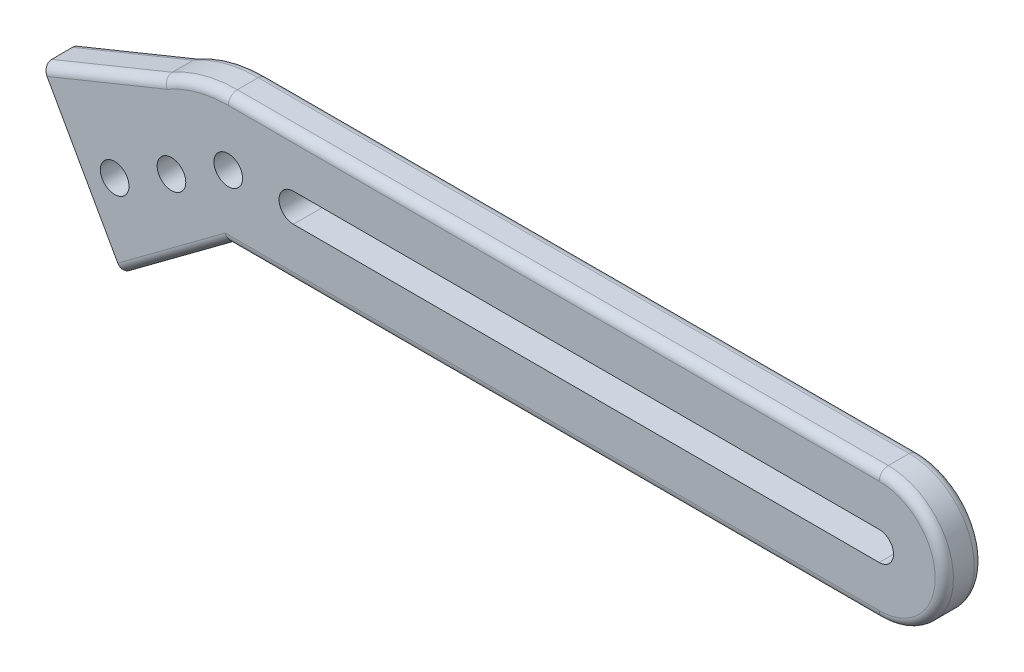
ISO-10303-21;
HEADER;
FILE_DESCRIPTION(('STEP AP214'),'2;1');
FILE_NAME('part.step','',(''),(''),'','','');
FILE_SCHEMA(('AUTOMOTIVE_DESIGN { 1 0 10303 214 1 1 1 1 }'));
ENDSEC;
DATA;
#1=APPLICATION_CONTEXT('core data for automotive mechanical design processes');
#2=APPLICATION_PROTOCOL_DEFINITION('international standard','automotive_design',2000,#1);
#3=PRODUCT_CONTEXT('',#1,'mechanical');
#4=PRODUCT('Part','Part','',(#3));
#5=PRODUCT_RELATED_PRODUCT_CATEGORY('part','',(#4));
#6=PRODUCT_DEFINITION_FORMATION('','',#4);
#7=PRODUCT_DEFINITION_CONTEXT('part definition',#1,'design');
#8=PRODUCT_DEFINITION('design','',#6,#7);
#9=PRODUCT_DEFINITION_SHAPE('','',#8);
#10=(LENGTH_UNIT() NAMED_UNIT(*) SI_UNIT(.MILLI.,.METRE.));
#11=(NAMED_UNIT(*) PLANE_ANGLE_UNIT() SI_UNIT($,.RADIAN.));
#12=(NAMED_UNIT(*) SI_UNIT($,.STERADIAN.) SOLID_ANGLE_UNIT());
#13=UNCERTAINTY_MEASURE_WITH_UNIT(LENGTH_MEASURE(1.E-05),#10,'distance_accuracy_value','');
#14=(GEOMETRIC_REPRESENTATION_CONTEXT(3) GLOBAL_UNCERTAINTY_ASSIGNED_CONTEXT((#13)) GLOBAL_UNIT_ASSIGNED_CONTEXT((#10,
#11,#12)) REPRESENTATION_CONTEXT('',''));
#15=CARTESIAN_POINT('',(0.,0.,0.));
#16=DIRECTION('',(0.,0.,1.));
#17=DIRECTION('',(1.,0.,0.));
#18=AXIS2_PLACEMENT_3D('',#15,#16,#17);
#19=CARTESIAN_POINT('',(0.,-5.,3.));
#20=DIRECTION('',(0.,0.,-1.));
#21=DIRECTION('',(-1.,0.,0.));
#22=AXIS2_PLACEMENT_3D('',#19,#20,#21);
#23=CYLINDRICAL_SURFACE('',#22,10.);
#24=DIRECTION('',(0.,0.,-1.));
#25=VECTOR('',#24,1.);
#26=CARTESIAN_POINT('',(-4.99999999999996,3.66025403784442,3.));
#27=LINE('',#26,#25);
#28=CARTESIAN_POINT('',(-4.99999999999996,3.66025403784442,2.3));
#29=VERTEX_POINT('',#28);
#30=CARTESIAN_POINT('',(-4.99999999999996,3.66025403784442,0.7));
#31=VERTEX_POINT('',#30);
#32=EDGE_CURVE('E392',#29,#31,#27,.T.);
#33=ORIENTED_EDGE('',*,*,#32,.F.);
#34=CARTESIAN_POINT('',(0.,-5.,2.3));
#35=DIRECTION('',(0.,0.,1.));
#36=DIRECTION('',(1.,0.,0.));
#37=AXIS2_PLACEMENT_3D('',#34,#35,#36);
#38=CIRCLE('',#37,10.);
#39=CARTESIAN_POINT('',(0.,5.,2.3));
#40=VERTEX_POINT('',#39);
#41=EDGE_CURVE('E225',#29,#40,#38,.F.);
#42=ORIENTED_EDGE('',*,*,#41,.T.);
#43=DIRECTION('',(0.,0.,-1.));
#44=VECTOR('',#43,1.);
#45=CARTESIAN_POINT('',(0.,5.,3.));
#46=LINE('',#45,#44);
#47=CARTESIAN_POINT('',(0.,5.,0.7));
#48=VERTEX_POINT('',#47);
#49=EDGE_CURVE('E519',#40,#48,#46,.T.);
#50=ORIENTED_EDGE('',*,*,#49,.T.);
#51=CARTESIAN_POINT('',(0.,-5.,0.7));
#52=DIRECTION('',(0.,0.,1.));
#53=DIRECTION('',(1.,0.,0.));
#54=AXIS2_PLACEMENT_3D('',#51,#52,#53);
#55=CIRCLE('',#54,10.);
#56=EDGE_CURVE('E222',#48,#31,#55,.T.);
#57=ORIENTED_EDGE('',*,*,#56,.T.);
#58=EDGE_LOOP('',(#33,#42,#50,#57));
#59=FACE_BOUND('',#58,.T.);
#60=ADVANCED_FACE('F44',(#59),#23,.T.);
#61=CARTESIAN_POINT('',(-4.99999999999996,3.66025403784442,3.));
#62=DIRECTION('',(0.377162887212808,-0.926146941100222,0.));
#63=DIRECTION('',(0.926146941100222,0.377162887212808,0.));
#64=AXIS2_PLACEMENT_3D('',#61,#62,#63);
#65=PLANE('',#64);
#66=DIRECTION('',(-0.926146941100222,-0.377162887212808,0.));
#67=VECTOR('',#66,1.);
#68=CARTESIAN_POINT('',(-4.99999999999996,3.66025403784442,0.7));
#69=LINE('',#68,#67);
#70=CARTESIAN_POINT('',(-14.2634471787925,-0.112180257890802,0.7));
#71=VERTEX_POINT('',#70);
#72=EDGE_CURVE('E234',#31,#71,#69,.T.);
#73=ORIENTED_EDGE('',*,*,#72,.T.);
#74=DIRECTION('',(0.,0.,1.));
#75=VECTOR('',#74,1.);
#76=CARTESIAN_POINT('',(-14.2634471787925,-0.112180257890802,3.));
#77=LINE('',#76,#75);
#78=CARTESIAN_POINT('',(-14.2634471787925,-0.112180257890802,2.3));
#79=VERTEX_POINT('',#78);
#80=EDGE_CURVE('E454',#71,#79,#77,.T.);
#81=ORIENTED_EDGE('',*,*,#80,.T.);
#82=DIRECTION('',(-0.926146941100222,-0.377162887212808,0.));
#83=VECTOR('',#82,1.);
#84=CARTESIAN_POINT('',(-4.99999999999996,3.66025403784442,2.3));
#85=LINE('',#84,#83);
#86=EDGE_CURVE('E238',#79,#29,#85,.F.);
#87=ORIENTED_EDGE('',*,*,#86,.T.);
#88=ORIENTED_EDGE('',*,*,#32,.T.);
#89=EDGE_LOOP('',(#73,#81,#87,#88));
#90=FACE_BOUND('',#89,.T.);
#91=ADVANCED_FACE('F278',(#90),#65,.F.);
#92=CARTESIAN_POINT('',(0.,-5.,3.));
#93=DIRECTION('',(-0.596248636176985,0.802799828012616,0.));
#94=DIRECTION('',(-0.802799828012616,-0.596248636176985,0.));
#95=AXIS2_PLACEMENT_3D('',#92,#93,#94);
#96=PLANE('',#95);
#97=DIRECTION('',(0.802799828012616,0.596248636176985,0.));
#98=VECTOR('',#97,1.);
#99=CARTESIAN_POINT('',(-176.615962162776,-136.174699958937,2.3));
#100=LINE('',#99,#98);
#101=CARTESIAN_POINT('',(0.,-5.,2.3));
#102=VERTEX_POINT('',#101);
#103=CARTESIAN_POINT('',(-8.14085036954468,-11.0463029024038,2.3));
#104=VERTEX_POINT('',#103);
#105=EDGE_CURVE('E241',#102,#104,#100,.F.);
#106=ORIENTED_EDGE('',*,*,#105,.T.);
#107=DIRECTION('',(0.,0.,-1.));
#108=VECTOR('',#107,1.);
#109=CARTESIAN_POINT('',(-8.14085036954467,-11.0463029024038,3.));
#110=LINE('',#109,#108);
#111=CARTESIAN_POINT('',(-8.14085036954467,-11.0463029024038,0.7));
#112=VERTEX_POINT('',#111);
#113=EDGE_CURVE('E59',#104,#112,#110,.T.);
#114=ORIENTED_EDGE('',*,*,#113,.T.);
#115=DIRECTION('',(0.802799828012616,0.596248636176985,0.));
#116=VECTOR('',#115,1.);
#117=CARTESIAN_POINT('',(0.,-5.,0.7));
#118=LINE('',#117,#116);
#119=CARTESIAN_POINT('',(0.,-5.,0.7));
#120=VERTEX_POINT('',#119);
#121=EDGE_CURVE('E53',#112,#120,#118,.T.);
#122=ORIENTED_EDGE('',*,*,#121,.T.);
#123=DIRECTION('',(0.,0.,-1.));
#124=VECTOR('',#123,1.);
#125=CARTESIAN_POINT('',(0.,-5.,3.));
#126=LINE('',#125,#124);
#127=EDGE_CURVE('E387',#102,#120,#126,.T.);
#128=ORIENTED_EDGE('',*,*,#127,.F.);
#129=EDGE_LOOP('',(#106,#114,#122,#128));
#130=FACE_BOUND('',#129,.T.);
#131=ADVANCED_FACE('F282',(#130),#96,.F.);
#132=CARTESIAN_POINT('',(0.,-5.,3.));
#133=DIRECTION('',(0.,1.,0.));
#134=DIRECTION('',(0.,0.,1.));
#135=AXIS2_PLACEMENT_3D('',#132,#133,#134);
#136=PLANE('',#135);
#137=ORIENTED_EDGE('',*,*,#127,.T.);
#138=DIRECTION('',(1.,0.,0.));
#139=VECTOR('',#138,1.);
#140=CARTESIAN_POINT('',(0.,-5.,0.7));
#141=LINE('',#140,#139);
#142=CARTESIAN_POINT('',(50.,-5.,0.7));
#143=VERTEX_POINT('',#142);
#144=EDGE_CURVE('E231',#120,#143,#141,.T.);
#145=ORIENTED_EDGE('',*,*,#144,.T.);
#146=DIRECTION('',(0.,0.,-1.));
#147=VECTOR('',#146,1.);
#148=CARTESIAN_POINT('',(50.,-5.,3.));
#149=LINE('',#148,#147);
#150=CARTESIAN_POINT('',(50.,-5.,2.3));
#151=VERTEX_POINT('',#150);
#152=EDGE_CURVE('E390',#151,#143,#149,.T.);
#153=ORIENTED_EDGE('',*,*,#152,.F.);
#154=DIRECTION('',(1.,0.,0.));
#155=VECTOR('',#154,1.);
#156=CARTESIAN_POINT('',(0.,-5.,2.3));
#157=LINE('',#156,#155);
#158=EDGE_CURVE('E228',#151,#102,#157,.F.);
#159=ORIENTED_EDGE('',*,*,#158,.T.);
#160=EDGE_LOOP('',(#137,#145,#153,#159));
#161=FACE_BOUND('',#160,.T.);
#162=ADVANCED_FACE('F286',(#161),#136,.F.);
#163=CARTESIAN_POINT('',(50.,0.,3.));
#164=DIRECTION('',(0.,0.,-1.));
#165=DIRECTION('',(-1.,0.,0.));
#166=AXIS2_PLACEMENT_3D('',#163,#164,#165);
#167=CYLINDRICAL_SURFACE('',#166,5.);
#168=ORIENTED_EDGE('',*,*,#152,.T.);
#169=CARTESIAN_POINT('',(50.,0.,0.7));
#170=DIRECTION('',(0.,0.,1.));
#171=DIRECTION('',(1.,0.,0.));
#172=AXIS2_PLACEMENT_3D('',#169,#170,#171);
#173=CIRCLE('',#172,5.);
#174=CARTESIAN_POINT('',(50.,5.,0.7));
#175=VERTEX_POINT('',#174);
#176=EDGE_CURVE('E213',#143,#175,#173,.T.);
#177=ORIENTED_EDGE('',*,*,#176,.T.);
#178=DIRECTION('',(0.,0.,-1.));
#179=VECTOR('',#178,1.);
#180=CARTESIAN_POINT('',(50.,5.,3.));
#181=LINE('',#180,#179);
#182=CARTESIAN_POINT('',(50.,5.,2.3));
#183=VERTEX_POINT('',#182);
#184=EDGE_CURVE('E399',#183,#175,#181,.T.);
#185=ORIENTED_EDGE('',*,*,#184,.F.);
#186=CARTESIAN_POINT('',(50.,0.,2.3));
#187=DIRECTION('',(0.,0.,1.));
#188=DIRECTION('',(1.,0.,0.));
#189=AXIS2_PLACEMENT_3D('',#186,#187,#188);
#190=CIRCLE('',#189,5.);
#191=EDGE_CURVE('E210',#183,#151,#190,.F.);
#192=ORIENTED_EDGE('',*,*,#191,.T.);
#193=EDGE_LOOP('',(#168,#177,#185,#192));
#194=FACE_BOUND('',#193,.T.);
#195=ADVANCED_FACE('F289',(#194),#167,.T.);
#196=CARTESIAN_POINT('',(0.,5.,3.));
#197=DIRECTION('',(0.,-1.,0.));
#198=DIRECTION('',(1.,0.,0.));
#199=AXIS2_PLACEMENT_3D('',#196,#197,#198);
#200=PLANE('',#199);
#201=ORIENTED_EDGE('',*,*,#49,.F.);
#202=DIRECTION('',(-1.,0.,0.));
#203=VECTOR('',#202,1.);
#204=CARTESIAN_POINT('',(50.,5.,2.3));
#205=LINE('',#204,#203);
#206=EDGE_CURVE('E219',#40,#183,#205,.F.);
#207=ORIENTED_EDGE('',*,*,#206,.T.);
#208=ORIENTED_EDGE('',*,*,#184,.T.);
#209=DIRECTION('',(-1.,0.,0.));
#210=VECTOR('',#209,1.);
#211=CARTESIAN_POINT('',(0.,5.,0.7));
#212=LINE('',#211,#210);
#213=EDGE_CURVE('E216',#175,#48,#212,.T.);
#214=ORIENTED_EDGE('',*,*,#213,.T.);
#215=EDGE_LOOP('',(#201,#207,#208,#214));
#216=FACE_BOUND('',#215,.T.);
#217=ADVANCED_FACE('F293',(#216),#200,.F.);
#218=CARTESIAN_POINT('',(0.,-5.,3.));
#219=DIRECTION('',(0.,0.,1.));
#220=DIRECTION('',(1.,0.,0.));
#221=AXIS2_PLACEMENT_3D('',#218,#219,#220);
#222=PLANE('',#221);
#223=DIRECTION('',(-0.488572273581656,0.872523428617966,0.));
#224=VECTOR('',#223,1.);
#225=CARTESIAN_POINT('',(-10.9065428577246,-6.10715341977064,3.));
#226=LINE('',#225,#224);
#227=CARTESIAN_POINT('',(-8.48568821434412,-10.4304695550549,3.));
#228=VERTEX_POINT('',#227);
#229=CARTESIAN_POINT('',(-13.9188122786738,-0.727651173726009,3.));
#230=VERTEX_POINT('',#229);
#231=EDGE_CURVE('E168',#228,#230,#226,.T.);
#232=ORIENTED_EDGE('',*,*,#231,.F.);
#233=DIRECTION('',(0.802799828012616,0.596248636176985,0.));
#234=VECTOR('',#233,1.);
#235=CARTESIAN_POINT('',(-0.417374045323888,-4.43804012039117,3.));
#236=LINE('',#235,#234);
#237=CARTESIAN_POINT('',(-0.231514358298999,-4.3,3.));
#238=VERTEX_POINT('',#237);
#239=EDGE_CURVE('E178',#228,#238,#236,.T.);
#240=ORIENTED_EDGE('',*,*,#239,.T.);
#241=DIRECTION('',(1.,0.,0.));
#242=VECTOR('',#241,1.);
#243=CARTESIAN_POINT('',(50.,-4.3,3.));
#244=LINE('',#243,#242);
#245=CARTESIAN_POINT('',(50.,-4.3,3.));
#246=VERTEX_POINT('',#245);
#247=EDGE_CURVE('E189',#238,#246,#244,.T.);
#248=ORIENTED_EDGE('',*,*,#247,.T.);
#249=CARTESIAN_POINT('',(50.,0.,3.));
#250=DIRECTION('',(0.,0.,1.));
#251=DIRECTION('',(1.,0.,0.));
#252=AXIS2_PLACEMENT_3D('',#249,#250,#251);
#253=CIRCLE('',#252,4.3);
#254=CARTESIAN_POINT('',(50.,4.3,3.));
#255=VERTEX_POINT('',#254);
#256=EDGE_CURVE('E194',#246,#255,#253,.T.);
#257=ORIENTED_EDGE('',*,*,#256,.T.);
#258=DIRECTION('',(-1.,0.,0.));
#259=VECTOR('',#258,1.);
#260=CARTESIAN_POINT('',(0.,4.3,3.));
#261=LINE('',#260,#259);
#262=CARTESIAN_POINT('',(0.,4.30000000000001,3.));
#263=VERTEX_POINT('',#262);
#264=EDGE_CURVE('E207',#255,#263,#261,.T.);
#265=ORIENTED_EDGE('',*,*,#264,.T.);
#266=CARTESIAN_POINT('',(0.,-5.,3.));
#267=DIRECTION('',(0.,0.,1.));
#268=DIRECTION('',(1.,0.,0.));
#269=AXIS2_PLACEMENT_3D('',#266,#267,#268);
#270=CIRCLE('',#269,9.30000000000001);
#271=CARTESIAN_POINT('',(-4.69074070136346,3.03037680763315,3.));
#272=VERTEX_POINT('',#271);
#273=EDGE_CURVE('E204',#263,#272,#270,.T.);
#274=ORIENTED_EDGE('',*,*,#273,.T.);
#275=DIRECTION('',(-0.926146941100222,-0.377162887212808,0.));
#276=VECTOR('',#275,1.);
#277=CARTESIAN_POINT('',(-208.488313021,-79.9638840077436,3.));
#278=LINE('',#277,#276);
#279=EDGE_CURVE('E181',#272,#230,#278,.T.);
#280=ORIENTED_EDGE('',*,*,#279,.T.);
#281=EDGE_LOOP('',(#232,#240,#248,#257,#265,#274,#280));
#282=FACE_BOUND('',#281,.T.);
#283=CARTESIAN_POINT('',(-8.72523428617969,-4.88572273581651,3.));
#284=DIRECTION('',(0.,0.,1.));
#285=DIRECTION('',(1.,0.,0.));
#286=AXIS2_PLACEMENT_3D('',#283,#284,#285);
#287=CIRCLE('',#286,1.09999999999999);
#288=CARTESIAN_POINT('',(-7.6252342861797,-4.88572273581651,3.));
#289=VERTEX_POINT('',#288);
#290=EDGE_CURVE('E430',#289,#289,#287,.T.);
#291=ORIENTED_EDGE('',*,*,#290,.F.);
#292=EDGE_LOOP('',(#291));
#293=FACE_BOUND('',#292,.T.);
#294=CARTESIAN_POINT('',(-4.36261714308985,-2.44286136790826,3.));
#295=DIRECTION('',(0.,0.,1.));
#296=DIRECTION('',(1.,0.,0.));
#297=AXIS2_PLACEMENT_3D('',#294,#295,#296);
#298=CIRCLE('',#297,1.09999999999999);
#299=CARTESIAN_POINT('',(-3.26261714308986,-2.44286136790826,3.));
#300=VERTEX_POINT('',#299);
#301=EDGE_CURVE('E468',#300,#300,#298,.T.);
#302=ORIENTED_EDGE('',*,*,#301,.F.);
#303=EDGE_LOOP('',(#302));
#304=FACE_BOUND('',#303,.T.);
#305=CARTESIAN_POINT('',(0.,0.,3.));
#306=DIRECTION('',(0.,0.,1.));
#307=DIRECTION('',(1.,0.,0.));
#308=AXIS2_PLACEMENT_3D('',#305,#306,#307);
#309=CIRCLE('',#308,1.09999999999999);
#310=CARTESIAN_POINT('',(1.09999999999999,0.,3.));
#311=VERTEX_POINT('',#310);
#312=EDGE_CURVE('E476',#311,#311,#309,.T.);
#313=ORIENTED_EDGE('',*,*,#312,.F.);
#314=EDGE_LOOP('',(#313));
#315=FACE_BOUND('',#314,.T.);
#316=CARTESIAN_POINT('',(5.,0.,3.));
#317=DIRECTION('',(0.,0.,1.));
#318=DIRECTION('',(1.,0.,0.));
#319=AXIS2_PLACEMENT_3D('',#316,#317,#318);
#320=CIRCLE('',#319,1.1);
#321=CARTESIAN_POINT('',(5.,1.1,3.));
#322=VERTEX_POINT('',#321);
#323=CARTESIAN_POINT('',(5.,-1.1,3.));
#324=VERTEX_POINT('',#323);
#325=EDGE_CURVE('E484',#322,#324,#320,.T.);
#326=ORIENTED_EDGE('',*,*,#325,.F.);
#327=DIRECTION('',(-1.,0.,0.));
#328=VECTOR('',#327,1.);
#329=CARTESIAN_POINT('',(5.,1.1,3.));
#330=LINE('',#329,#328);
#331=CARTESIAN_POINT('',(50.,1.1,3.));
#332=VERTEX_POINT('',#331);
#333=EDGE_CURVE('E490',#332,#322,#330,.T.);
#334=ORIENTED_EDGE('',*,*,#333,.F.);
#335=CARTESIAN_POINT('',(50.,0.,3.));
#336=DIRECTION('',(0.,0.,1.));
#337=DIRECTION('',(1.,0.,0.));
#338=AXIS2_PLACEMENT_3D('',#335,#336,#337);
#339=CIRCLE('',#338,1.1);
#340=CARTESIAN_POINT('',(50.,-1.1,3.));
#341=VERTEX_POINT('',#340);
#342=EDGE_CURVE('E509',#341,#332,#339,.T.);
#343=ORIENTED_EDGE('',*,*,#342,.F.);
#344=DIRECTION('',(1.,0.,0.));
#345=VECTOR('',#344,1.);
#346=CARTESIAN_POINT('',(5.,-1.1,3.));
#347=LINE('',#346,#345);
#348=EDGE_CURVE('E505',#324,#341,#347,.T.);
#349=ORIENTED_EDGE('',*,*,#348,.F.);
#350=EDGE_LOOP('',(#326,#334,#343,#349));
#351=FACE_BOUND('',#350,.T.);
#352=ADVANCED_FACE('F176',(#282,#293,#304,#315,#351),#222,.T.);
#353=CARTESIAN_POINT('',(0.,-5.,0.));
#354=DIRECTION('',(0.,0.,1.));
#355=DIRECTION('',(1.,0.,0.));
#356=AXIS2_PLACEMENT_3D('',#353,#354,#355);
#357=PLANE('',#356);
#358=DIRECTION('',(0.802799828012616,0.596248636176985,0.));
#359=VECTOR('',#358,1.);
#360=CARTESIAN_POINT('',(-0.417374045323892,-4.43804012039117,0.));
#361=LINE('',#360,#359);
#362=CARTESIAN_POINT('',(-0.231514358298999,-4.3,0.));
#363=VERTEX_POINT('',#362);
#364=CARTESIAN_POINT('',(-8.48568821434412,-10.4304695550549,0.));
#365=VERTEX_POINT('',#364);
#366=EDGE_CURVE('E397',#363,#365,#361,.F.);
#367=ORIENTED_EDGE('',*,*,#366,.T.);
#368=DIRECTION('',(-0.488572273581656,0.872523428617967,0.));
#369=VECTOR('',#368,1.);
#370=CARTESIAN_POINT('',(-8.77508908135887,-9.91363908720696,0.));
#371=LINE('',#370,#369);
#372=CARTESIAN_POINT('',(-13.9188122786738,-0.727651173726005,0.));
#373=VERTEX_POINT('',#372);
#374=EDGE_CURVE('E440',#365,#373,#371,.T.);
#375=ORIENTED_EDGE('',*,*,#374,.T.);
#376=DIRECTION('',(-0.926146941100222,-0.377162887212808,0.));
#377=VECTOR('',#376,1.);
#378=CARTESIAN_POINT('',(-3.47234341606038,3.52655534853645,0.));
#379=LINE('',#378,#377);
#380=CARTESIAN_POINT('',(-4.69074070136347,3.03037680763315,0.));
#381=VERTEX_POINT('',#380);
#382=EDGE_CURVE('E412',#373,#381,#379,.F.);
#383=ORIENTED_EDGE('',*,*,#382,.T.);
#384=CARTESIAN_POINT('',(0.,-5.,0.));
#385=DIRECTION('',(0.,0.,1.));
#386=DIRECTION('',(1.,0.,0.));
#387=AXIS2_PLACEMENT_3D('',#384,#385,#386);
#388=CIRCLE('',#387,9.30000000000001);
#389=CARTESIAN_POINT('',(0.,4.3,0.));
#390=VERTEX_POINT('',#389);
#391=EDGE_CURVE('E190',#381,#390,#388,.F.);
#392=ORIENTED_EDGE('',*,*,#391,.T.);
#393=DIRECTION('',(-1.,0.,0.));
#394=VECTOR('',#393,1.);
#395=CARTESIAN_POINT('',(0.,4.3,0.));
#396=LINE('',#395,#394);
#397=CARTESIAN_POINT('',(50.,4.3,0.));
#398=VERTEX_POINT('',#397);
#399=EDGE_CURVE('E196',#390,#398,#396,.F.);
#400=ORIENTED_EDGE('',*,*,#399,.T.);
#401=CARTESIAN_POINT('',(50.,0.,0.));
#402=DIRECTION('',(0.,0.,1.));
#403=DIRECTION('',(1.,0.,0.));
#404=AXIS2_PLACEMENT_3D('',#401,#402,#403);
#405=CIRCLE('',#404,4.3);
#406=CARTESIAN_POINT('',(50.,-4.3,0.));
#407=VERTEX_POINT('',#406);
#408=EDGE_CURVE('E409',#398,#407,#405,.F.);
#409=ORIENTED_EDGE('',*,*,#408,.T.);
#410=DIRECTION('',(1.,0.,0.));
#411=VECTOR('',#410,1.);
#412=CARTESIAN_POINT('',(0.,-4.3,0.));
#413=LINE('',#412,#411);
#414=EDGE_CURVE('E406',#407,#363,#413,.F.);
#415=ORIENTED_EDGE('',*,*,#414,.T.);
#416=EDGE_LOOP('',(#367,#375,#383,#392,#400,#409,#415));
#417=FACE_BOUND('',#416,.T.);
#418=CARTESIAN_POINT('',(-8.72523428617969,-4.88572273581651,0.));
#419=DIRECTION('',(0.,0.,1.));
#420=DIRECTION('',(1.,0.,0.));
#421=AXIS2_PLACEMENT_3D('',#418,#419,#420);
#422=CIRCLE('',#421,1.09999999999999);
#423=CARTESIAN_POINT('',(-7.6252342861797,-4.88572273581651,0.));
#424=VERTEX_POINT('',#423);
#425=EDGE_CURVE('E464',#424,#424,#422,.T.);
#426=ORIENTED_EDGE('',*,*,#425,.T.);
#427=EDGE_LOOP('',(#426));
#428=FACE_BOUND('',#427,.T.);
#429=CARTESIAN_POINT('',(-4.36261714308985,-2.44286136790826,0.));
#430=DIRECTION('',(0.,0.,1.));
#431=DIRECTION('',(1.,0.,0.));
#432=AXIS2_PLACEMENT_3D('',#429,#430,#431);
#433=CIRCLE('',#432,1.09999999999999);
#434=CARTESIAN_POINT('',(-3.26261714308985,-2.44286136790826,0.));
#435=VERTEX_POINT('',#434);
#436=EDGE_CURVE('E472',#435,#435,#433,.T.);
#437=ORIENTED_EDGE('',*,*,#436,.T.);
#438=EDGE_LOOP('',(#437));
#439=FACE_BOUND('',#438,.T.);
#440=CARTESIAN_POINT('',(0.,0.,0.));
#441=DIRECTION('',(0.,0.,1.));
#442=DIRECTION('',(1.,0.,0.));
#443=AXIS2_PLACEMENT_3D('',#440,#441,#442);
#444=CIRCLE('',#443,1.09999999999999);
#445=CARTESIAN_POINT('',(1.09999999999999,0.,0.));
#446=VERTEX_POINT('',#445);
#447=EDGE_CURVE('E480',#446,#446,#444,.T.);
#448=ORIENTED_EDGE('',*,*,#447,.T.);
#449=EDGE_LOOP('',(#448));
#450=FACE_BOUND('',#449,.T.);
#451=DIRECTION('',(-1.,0.,0.));
#452=VECTOR('',#451,1.);
#453=CARTESIAN_POINT('',(5.,1.1,0.));
#454=LINE('',#453,#452);
#455=CARTESIAN_POINT('',(50.,1.1,0.));
#456=VERTEX_POINT('',#455);
#457=CARTESIAN_POINT('',(5.,1.1,0.));
#458=VERTEX_POINT('',#457);
#459=EDGE_CURVE('E498',#456,#458,#454,.T.);
#460=ORIENTED_EDGE('',*,*,#459,.T.);
#461=CARTESIAN_POINT('',(5.,0.,0.));
#462=DIRECTION('',(0.,0.,1.));
#463=DIRECTION('',(1.,0.,0.));
#464=AXIS2_PLACEMENT_3D('',#461,#462,#463);
#465=CIRCLE('',#464,1.1);
#466=CARTESIAN_POINT('',(5.,-1.1,0.));
#467=VERTEX_POINT('',#466);
#468=EDGE_CURVE('E485',#458,#467,#465,.T.);
#469=ORIENTED_EDGE('',*,*,#468,.T.);
#470=DIRECTION('',(1.,0.,0.));
#471=VECTOR('',#470,1.);
#472=CARTESIAN_POINT('',(5.,-1.1,0.));
#473=LINE('',#472,#471);
#474=CARTESIAN_POINT('',(50.,-1.1,0.));
#475=VERTEX_POINT('',#474);
#476=EDGE_CURVE('E489',#467,#475,#473,.T.);
#477=ORIENTED_EDGE('',*,*,#476,.T.);
#478=CARTESIAN_POINT('',(50.,0.,0.));
#479=DIRECTION('',(0.,0.,1.));
#480=DIRECTION('',(1.,0.,0.));
#481=AXIS2_PLACEMENT_3D('',#478,#479,#480);
#482=CIRCLE('',#481,1.1);
#483=EDGE_CURVE('E494',#475,#456,#482,.T.);
#484=ORIENTED_EDGE('',*,*,#483,.T.);
#485=EDGE_LOOP('',(#460,#469,#477,#484));
#486=FACE_BOUND('',#485,.T.);
#487=ADVANCED_FACE('F298',(#417,#428,#439,#450,#486),#357,.F.);
#488=CARTESIAN_POINT('',(5.,0.,0.));
#489=DIRECTION('',(0.,0.,1.));
#490=DIRECTION('',(1.,0.,0.));
#491=AXIS2_PLACEMENT_3D('',#488,#489,#490);
#492=CYLINDRICAL_SURFACE('',#491,1.1);
#493=ORIENTED_EDGE('',*,*,#325,.T.);
#494=DIRECTION('',(0.,0.,1.));
#495=VECTOR('',#494,1.);
#496=CARTESIAN_POINT('',(5.,-1.1,0.));
#497=LINE('',#496,#495);
#498=EDGE_CURVE('E502',#467,#324,#497,.T.);
#499=ORIENTED_EDGE('',*,*,#498,.F.);
#500=ORIENTED_EDGE('',*,*,#468,.F.);
#501=DIRECTION('',(0.,0.,1.));
#502=VECTOR('',#501,1.);
#503=CARTESIAN_POINT('',(5.,1.1,0.));
#504=LINE('',#503,#502);
#505=EDGE_CURVE('E516',#458,#322,#504,.T.);
#506=ORIENTED_EDGE('',*,*,#505,.T.);
#507=EDGE_LOOP('',(#493,#499,#500,#506));
#508=FACE_BOUND('',#507,.T.);
#509=ADVANCED_FACE('F301',(#508),#492,.F.);
#510=CARTESIAN_POINT('',(5.,1.1,0.));
#511=DIRECTION('',(0.,1.,0.));
#512=DIRECTION('',(-1.,0.,0.));
#513=AXIS2_PLACEMENT_3D('',#510,#511,#512);
#514=PLANE('',#513);
#515=ORIENTED_EDGE('',*,*,#333,.T.);
#516=ORIENTED_EDGE('',*,*,#505,.F.);
#517=ORIENTED_EDGE('',*,*,#459,.F.);
#518=DIRECTION('',(0.,0.,1.));
#519=VECTOR('',#518,1.);
#520=CARTESIAN_POINT('',(50.,1.1,0.));
#521=LINE('',#520,#519);
#522=EDGE_CURVE('E520',#456,#332,#521,.T.);
#523=ORIENTED_EDGE('',*,*,#522,.T.);
#524=EDGE_LOOP('',(#515,#516,#517,#523));
#525=FACE_BOUND('',#524,.T.);
#526=ADVANCED_FACE('F307',(#525),#514,.F.);
#527=CARTESIAN_POINT('',(50.,0.,0.));
#528=DIRECTION('',(0.,0.,1.));
#529=DIRECTION('',(1.,0.,0.));
#530=AXIS2_PLACEMENT_3D('',#527,#528,#529);
#531=CYLINDRICAL_SURFACE('',#530,1.1);
#532=ORIENTED_EDGE('',*,*,#342,.T.);
#533=ORIENTED_EDGE('',*,*,#522,.F.);
#534=ORIENTED_EDGE('',*,*,#483,.F.);
#535=DIRECTION('',(0.,0.,1.));
#536=VECTOR('',#535,1.);
#537=CARTESIAN_POINT('',(50.,-1.1,0.));
#538=LINE('',#537,#536);
#539=EDGE_CURVE('E523',#475,#341,#538,.T.);
#540=ORIENTED_EDGE('',*,*,#539,.T.);
#541=EDGE_LOOP('',(#532,#533,#534,#540));
#542=FACE_BOUND('',#541,.T.);
#543=ADVANCED_FACE('F313',(#542),#531,.F.);
#544=CARTESIAN_POINT('',(5.,-1.1,0.));
#545=DIRECTION('',(0.,-1.,0.));
#546=DIRECTION('',(0.,0.,-1.));
#547=AXIS2_PLACEMENT_3D('',#544,#545,#546);
#548=PLANE('',#547);
#549=ORIENTED_EDGE('',*,*,#348,.T.);
#550=ORIENTED_EDGE('',*,*,#539,.F.);
#551=ORIENTED_EDGE('',*,*,#476,.F.);
#552=ORIENTED_EDGE('',*,*,#498,.T.);
#553=EDGE_LOOP('',(#549,#550,#551,#552));
#554=FACE_BOUND('',#553,.T.);
#555=ADVANCED_FACE('F309',(#554),#548,.F.);
#556=CARTESIAN_POINT('',(0.,0.,3.));
#557=DIRECTION('',(0.,0.,1.));
#558=DIRECTION('',(1.,0.,0.));
#559=AXIS2_PLACEMENT_3D('',#556,#557,#558);
#560=CYLINDRICAL_SURFACE('',#559,1.09999999999999);
#561=ORIENTED_EDGE('',*,*,#447,.F.);
#562=EDGE_LOOP('',(#561));
#563=FACE_BOUND('',#562,.T.);
#564=ORIENTED_EDGE('',*,*,#312,.T.);
#565=EDGE_LOOP('',(#564));
#566=FACE_BOUND('',#565,.T.);
#567=ADVANCED_FACE('F312',(#563,#566),#560,.F.);
#568=CARTESIAN_POINT('',(-4.36261714308985,-2.44286136790826,3.));
#569=DIRECTION('',(0.,0.,1.));
#570=DIRECTION('',(1.,0.,0.));
#571=AXIS2_PLACEMENT_3D('',#568,#569,#570);
#572=CYLINDRICAL_SURFACE('',#571,1.09999999999999);
#573=ORIENTED_EDGE('',*,*,#436,.F.);
#574=EDGE_LOOP('',(#573));
#575=FACE_BOUND('',#574,.T.);
#576=ORIENTED_EDGE('',*,*,#301,.T.);
#577=EDGE_LOOP('',(#576));
#578=FACE_BOUND('',#577,.T.);
#579=ADVANCED_FACE('F323',(#575,#578),#572,.F.);
#580=CARTESIAN_POINT('',(-8.72523428617969,-4.88572273581651,3.));
#581=DIRECTION('',(0.,0.,1.));
#582=DIRECTION('',(1.,0.,0.));
#583=AXIS2_PLACEMENT_3D('',#580,#581,#582);
#584=CYLINDRICAL_SURFACE('',#583,1.09999999999999);
#585=ORIENTED_EDGE('',*,*,#425,.F.);
#586=EDGE_LOOP('',(#585));
#587=FACE_BOUND('',#586,.T.);
#588=ORIENTED_EDGE('',*,*,#290,.T.);
#589=EDGE_LOOP('',(#588));
#590=FACE_BOUND('',#589,.T.);
#591=ADVANCED_FACE('F327',(#587,#590),#584,.F.);
#592=CARTESIAN_POINT('',(0.,4.3,0.7));
#593=DIRECTION('',(-1.,0.,0.));
#594=DIRECTION('',(0.,-1.,0.));
#595=AXIS2_PLACEMENT_3D('',#592,#593,#594);
#596=CYLINDRICAL_SURFACE('',#595,0.7);
#597=CARTESIAN_POINT('',(0.,4.3,0.7));
#598=DIRECTION('',(-1.,0.,0.));
#599=DIRECTION('',(0.,0.,1.));
#600=AXIS2_PLACEMENT_3D('',#597,#598,#599);
#601=CIRCLE('',#600,0.7);
#602=EDGE_CURVE('E431',#48,#390,#601,.T.);
#603=ORIENTED_EDGE('',*,*,#602,.F.);
#604=ORIENTED_EDGE('',*,*,#213,.F.);
#605=CARTESIAN_POINT('',(50.,4.3,0.7));
#606=DIRECTION('',(1.,0.,0.));
#607=DIRECTION('',(0.,0.,-1.));
#608=AXIS2_PLACEMENT_3D('',#605,#606,#607);
#609=CIRCLE('',#608,0.7);
#610=EDGE_CURVE('E426',#398,#175,#609,.T.);
#611=ORIENTED_EDGE('',*,*,#610,.F.);
#612=ORIENTED_EDGE('',*,*,#399,.F.);
#613=EDGE_LOOP('',(#603,#604,#611,#612));
#614=FACE_BOUND('',#613,.T.);
#615=ADVANCED_FACE('F331',(#614),#596,.T.);
#616=CARTESIAN_POINT('',(50.,0.,0.7));
#617=DIRECTION('',(0.,0.,1.));
#618=DIRECTION('',(1.,0.,0.));
#619=AXIS2_PLACEMENT_3D('',#616,#617,#618);
#620=TOROIDAL_SURFACE('',#619,4.3,0.7);
#621=ORIENTED_EDGE('',*,*,#610,.T.);
#622=ORIENTED_EDGE('',*,*,#176,.F.);
#623=CARTESIAN_POINT('',(50.,-4.3,0.7));
#624=DIRECTION('',(-1.,0.,0.));
#625=DIRECTION('',(0.,0.,1.));
#626=AXIS2_PLACEMENT_3D('',#623,#624,#625);
#627=CIRCLE('',#626,0.7);
#628=EDGE_CURVE('E261',#407,#143,#627,.T.);
#629=ORIENTED_EDGE('',*,*,#628,.F.);
#630=ORIENTED_EDGE('',*,*,#408,.F.);
#631=EDGE_LOOP('',(#621,#622,#629,#630));
#632=FACE_BOUND('',#631,.T.);
#633=ADVANCED_FACE('F432',(#632),#620,.T.);
#634=CARTESIAN_POINT('',(0.,-5.,0.7));
#635=DIRECTION('',(0.,0.,1.));
#636=DIRECTION('',(1.,0.,0.));
#637=AXIS2_PLACEMENT_3D('',#634,#635,#636);
#638=TOROIDAL_SURFACE('',#637,9.30000000000001,0.7);
#639=ORIENTED_EDGE('',*,*,#602,.T.);
#640=ORIENTED_EDGE('',*,*,#391,.F.);
#641=CARTESIAN_POINT('',(-4.99999999999996,3.66025403784442,0.7));
#642=CARTESIAN_POINT('',(-5.00001466421688,3.66028451629037,0.660688033863781));
#643=CARTESIAN_POINT('',(-4.99854164794252,3.65727442009837,0.621386583623302));
#644=CARTESIAN_POINT('',(-4.99272853225734,3.64539812089088,0.543926302312074));
#645=CARTESIAN_POINT('',(-4.98839067416333,3.63653649583579,0.505766602365988));
#646=CARTESIAN_POINT('',(-4.97695323787729,3.61317621670657,0.431629677332299));
#647=CARTESIAN_POINT('',(-4.96985240236044,3.59867499627088,0.395653454489501));
#648=CARTESIAN_POINT('',(-4.95309653210851,3.56446641505823,0.326926193975758));
#649=CARTESIAN_POINT('',(-4.94344206241061,3.54476020597933,0.294174445029539));
#650=CARTESIAN_POINT('',(-4.92183910982039,3.50068136637913,0.23278057924935));
#651=CARTESIAN_POINT('',(-4.90988843635666,3.47630427991687,0.204142432741854));
#652=CARTESIAN_POINT('',(-4.88403094002651,3.42358250719941,0.151808165990024));
#653=CARTESIAN_POINT('',(-4.87012342981754,3.39523642684483,0.128113789546375));
#654=CARTESIAN_POINT('',(-4.8407117661697,3.33531891111624,0.0862901164650138));
#655=CARTESIAN_POINT('',(-4.82520367752924,3.30373952789912,0.0681749942186372));
#656=CARTESIAN_POINT('',(-4.79306204061535,3.23832350687372,0.0381091821245699));
#657=CARTESIAN_POINT('',(-4.77642953217781,3.20448895498678,0.0261528826292017));
#658=CARTESIAN_POINT('',(-4.74922039829897,3.14916967903179,0.012160265517922));
#659=CARTESIAN_POINT('',(-4.73884447367655,3.12808111472213,0.00807119298708505));
#660=CARTESIAN_POINT('',(-4.71796719627668,3.08566347984787,0.00230127963438677));
#661=CARTESIAN_POINT('',(-4.70746605184147,3.06433481138832,0.000616883875821569));
#662=CARTESIAN_POINT('',(-4.69488521704375,3.03879090337389,4.67960404400189E-05));
#663=CARTESIAN_POINT('',(-4.6928128677539,3.03458352631944,-1.25273676531795E-07));
#664=CARTESIAN_POINT('',(-4.69074070136343,3.03037680763316,0.));
#665=B_SPLINE_CURVE_WITH_KNOTS('',3,(#641,#642,#643,#644,#645,#646,#647,#648,#649,#650,#651,
#652,#653,#654,#655,#656,#657,#658,#659,#660,#661,#662,#663,#664),.UNSPECIFIED.,.F.,.F.,(4,2,2,
2,2,2,2,2,2,2,2,4),(0.,0.117778154624836,0.235464274171766,0.353204010898957,0.470917717368407,
0.588744284991886,0.70661234321646,0.824777427319164,0.942834691818997,1.01429790656345,
1.08565536438488,1.09972515680728),.UNSPECIFIED.);
#666=EDGE_CURVE('E250',#31,#381,#665,.T.);
#667=ORIENTED_EDGE('',*,*,#666,.F.);
#668=ORIENTED_EDGE('',*,*,#56,.F.);
#669=EDGE_LOOP('',(#639,#640,#667,#668));
#670=FACE_BOUND('',#669,.T.);
#671=ADVANCED_FACE('F263',(#670),#638,.T.);
#672=CARTESIAN_POINT('',(0.,-4.3,0.7));
#673=DIRECTION('',(1.,0.,0.));
#674=DIRECTION('',(0.,0.,-1.));
#675=AXIS2_PLACEMENT_3D('',#672,#673,#674);
#676=CYLINDRICAL_SURFACE('',#675,0.7);
#677=ORIENTED_EDGE('',*,*,#628,.T.);
#678=ORIENTED_EDGE('',*,*,#144,.F.);
#679=CARTESIAN_POINT('',(-0.231514358298999,-4.3,0.7));
#680=DIRECTION('',(0.949420830825987,0.314006506291975,0.));
#681=DIRECTION('',(0.314006506291975,-0.949420830825987,0.));
#682=AXIS2_PLACEMENT_3D('',#679,#680,#681);
#683=ELLIPSE('',#682,0.737291596384089,0.7);
#684=EDGE_CURVE('E246',#363,#120,#683,.F.);
#685=ORIENTED_EDGE('',*,*,#684,.F.);
#686=ORIENTED_EDGE('',*,*,#414,.F.);
#687=EDGE_LOOP('',(#677,#678,#685,#686));
#688=FACE_BOUND('',#687,.T.);
#689=ADVANCED_FACE('F271',(#688),#676,.T.);
#690=CARTESIAN_POINT('',(-4.73598597895099,3.01195117907427,0.7));
#691=DIRECTION('',(-0.926146941100222,-0.377162887212808,0.));
#692=DIRECTION('',(0.377162887212808,-0.926146941100222,0.));
#693=AXIS2_PLACEMENT_3D('',#690,#691,#692);
#694=CYLINDRICAL_SURFACE('',#693,0.7);
#695=CARTESIAN_POINT('',(-13.9188122786738,-0.727651173726008,0.7));
#696=DIRECTION('',(0.872523428617966,0.488572273581656,0.));
#697=DIRECTION('',(-0.488572273581656,0.872523428617967,0.));
#698=AXIS2_PLACEMENT_3D('',#695,#696,#697);
#699=ELLIPSE('',#698,0.70539185040576,0.7);
#700=EDGE_CURVE('E448',#71,#373,#699,.F.);
#701=ORIENTED_EDGE('',*,*,#700,.F.);
#702=ORIENTED_EDGE('',*,*,#72,.F.);
#703=ORIENTED_EDGE('',*,*,#666,.T.);
#704=ORIENTED_EDGE('',*,*,#382,.F.);
#705=EDGE_LOOP('',(#701,#702,#703,#704));
#706=FACE_BOUND('',#705,.T.);
#707=ADVANCED_FACE('F266',(#706),#694,.T.);
#708=CARTESIAN_POINT('',(-0.417374045323888,-4.43804012039117,0.7));
#709=DIRECTION('',(0.802799828012616,0.596248636176985,0.));
#710=DIRECTION('',(-0.596248636176985,0.802799828012616,0.));
#711=AXIS2_PLACEMENT_3D('',#708,#709,#710);
#712=CYLINDRICAL_SURFACE('',#711,0.7);
#713=CARTESIAN_POINT('',(-8.48568821434412,-10.4304695550549,0.7));
#714=DIRECTION('',(0.872523428617966,0.488572273581656,0.));
#715=DIRECTION('',(-0.488572273581656,0.872523428617967,0.));
#716=AXIS2_PLACEMENT_3D('',#713,#714,#715);
#717=ELLIPSE('',#716,0.705807233536792,0.7);
#718=EDGE_CURVE('E443',#365,#112,#717,.F.);
#719=ORIENTED_EDGE('',*,*,#718,.F.);
#720=ORIENTED_EDGE('',*,*,#366,.F.);
#721=ORIENTED_EDGE('',*,*,#684,.T.);
#722=ORIENTED_EDGE('',*,*,#121,.F.);
#723=EDGE_LOOP('',(#719,#720,#721,#722));
#724=FACE_BOUND('',#723,.T.);
#725=ADVANCED_FACE('F270',(#724),#712,.T.);
#726=CARTESIAN_POINT('',(0.,4.3,2.3));
#727=DIRECTION('',(1.,0.,0.));
#728=DIRECTION('',(0.,1.,0.));
#729=AXIS2_PLACEMENT_3D('',#726,#727,#728);
#730=CYLINDRICAL_SURFACE('',#729,0.7);
#731=CARTESIAN_POINT('',(0.,4.3,2.3));
#732=DIRECTION('',(-1.,0.,0.));
#733=DIRECTION('',(0.,-1.,0.));
#734=AXIS2_PLACEMENT_3D('',#731,#732,#733);
#735=CIRCLE('',#734,0.7);
#736=EDGE_CURVE('E367',#263,#40,#735,.T.);
#737=ORIENTED_EDGE('',*,*,#736,.F.);
#738=ORIENTED_EDGE('',*,*,#264,.F.);
#739=CARTESIAN_POINT('',(50.,4.3,2.3));
#740=DIRECTION('',(1.,0.,0.));
#741=DIRECTION('',(0.,0.,-1.));
#742=AXIS2_PLACEMENT_3D('',#739,#740,#741);
#743=CIRCLE('',#742,0.7);
#744=EDGE_CURVE('E251',#183,#255,#743,.T.);
#745=ORIENTED_EDGE('',*,*,#744,.F.);
#746=ORIENTED_EDGE('',*,*,#206,.F.);
#747=EDGE_LOOP('',(#737,#738,#745,#746));
#748=FACE_BOUND('',#747,.T.);
#749=ADVANCED_FACE('F46',(#748),#730,.T.);
#750=CARTESIAN_POINT('',(50.,0.,2.3));
#751=DIRECTION('',(0.,0.,1.));
#752=DIRECTION('',(1.,0.,0.));
#753=AXIS2_PLACEMENT_3D('',#750,#751,#752);
#754=TOROIDAL_SURFACE('',#753,4.3,0.7);
#755=ORIENTED_EDGE('',*,*,#744,.T.);
#756=ORIENTED_EDGE('',*,*,#256,.F.);
#757=CARTESIAN_POINT('',(50.,-4.3,2.3));
#758=DIRECTION('',(-1.,0.,0.));
#759=DIRECTION('',(0.,0.,1.));
#760=AXIS2_PLACEMENT_3D('',#757,#758,#759);
#761=CIRCLE('',#760,0.7);
#762=EDGE_CURVE('E362',#151,#246,#761,.T.);
#763=ORIENTED_EDGE('',*,*,#762,.F.);
#764=ORIENTED_EDGE('',*,*,#191,.F.);
#765=EDGE_LOOP('',(#755,#756,#763,#764));
#766=FACE_BOUND('',#765,.T.);
#767=ADVANCED_FACE('F376',(#766),#754,.T.);
#768=CARTESIAN_POINT('',(0.,-5.,2.3));
#769=DIRECTION('',(0.,0.,1.));
#770=DIRECTION('',(1.,0.,0.));
#771=AXIS2_PLACEMENT_3D('',#768,#769,#770);
#772=TOROIDAL_SURFACE('',#771,9.30000000000001,0.7);
#773=ORIENTED_EDGE('',*,*,#736,.T.);
#774=ORIENTED_EDGE('',*,*,#41,.F.);
#775=CARTESIAN_POINT('',(-4.99999999999996,3.66025403784442,2.3));
#776=CARTESIAN_POINT('',(-5.00001466421687,3.66028451629037,2.33931196613622));
#777=CARTESIAN_POINT('',(-4.99854164794251,3.65727442009838,2.3786134163767));
#778=CARTESIAN_POINT('',(-4.99272853225734,3.64539812089087,2.45607369768793));
#779=CARTESIAN_POINT('',(-4.98839067416333,3.63653649583579,2.49423339763401));
#780=CARTESIAN_POINT('',(-4.9769532378773,3.61317621670656,2.5683703226677));
#781=CARTESIAN_POINT('',(-4.96985240236044,3.59867499627088,2.6043465455105));
#782=CARTESIAN_POINT('',(-4.95309653210851,3.56446641505823,2.67307380602424));
#783=CARTESIAN_POINT('',(-4.94344206241061,3.54476020597933,2.70582555497046));
#784=CARTESIAN_POINT('',(-4.92183910982038,3.50068136637914,2.76721942075065));
#785=CARTESIAN_POINT('',(-4.90988843635666,3.47630427991687,2.79585756725815));
#786=CARTESIAN_POINT('',(-4.88403094002651,3.42358250719941,2.84819183400998));
#787=CARTESIAN_POINT('',(-4.87012342981754,3.39523642684483,2.87188621045363));
#788=CARTESIAN_POINT('',(-4.84071176616971,3.33531891111623,2.91370988353499));
#789=CARTESIAN_POINT('',(-4.82520367752924,3.30373952789911,2.93182500578136));
#790=CARTESIAN_POINT('',(-4.79306204061534,3.23832350687373,2.96189081787543));
#791=CARTESIAN_POINT('',(-4.77642953217779,3.20448895498679,2.9738471173708));
#792=CARTESIAN_POINT('',(-4.74922039829897,3.14916967903179,2.98783973448208));
#793=CARTESIAN_POINT('',(-4.73884447367657,3.12808111472212,2.99192880701291));
#794=CARTESIAN_POINT('',(-4.71796719627669,3.08566347984787,2.99769872036561));
#795=CARTESIAN_POINT('',(-4.70746605184144,3.06433481138834,2.99938311612418));
#796=CARTESIAN_POINT('',(-4.69488521704375,3.03879090337389,2.99995320395956));
#797=CARTESIAN_POINT('',(-4.6928128677539,3.03458352631944,3.00000012527368));
#798=CARTESIAN_POINT('',(-4.69074070136344,3.03037680763315,3.));
#799=B_SPLINE_CURVE_WITH_KNOTS('',3,(#775,#776,#777,#778,#779,#780,#781,#782,#783,#784,#785,
#786,#787,#788,#789,#790,#791,#792,#793,#794,#795,#796,#797,#798),.UNSPECIFIED.,.F.,.F.,(4,2,2,
2,2,2,2,2,2,2,2,4),(0.,0.117778154624836,0.235464274171767,0.353204010898958,0.470917717368408,
0.588744284991886,0.70661234321646,0.824777427319164,0.942834691818997,1.01429790656345,
1.08565536438488,1.09972515680728),.UNSPECIFIED.);
#800=EDGE_CURVE('E353',#272,#29,#799,.F.);
#801=ORIENTED_EDGE('',*,*,#800,.F.);
#802=ORIENTED_EDGE('',*,*,#273,.F.);
#803=EDGE_LOOP('',(#773,#774,#801,#802));
#804=FACE_BOUND('',#803,.T.);
#805=ADVANCED_FACE('F349',(#804),#772,.T.);
#806=CARTESIAN_POINT('',(0.,-4.3,2.3));
#807=DIRECTION('',(-1.,0.,0.));
#808=DIRECTION('',(0.,0.,1.));
#809=AXIS2_PLACEMENT_3D('',#806,#807,#808);
#810=CYLINDRICAL_SURFACE('',#809,0.7);
#811=ORIENTED_EDGE('',*,*,#762,.T.);
#812=ORIENTED_EDGE('',*,*,#247,.F.);
#813=CARTESIAN_POINT('',(-0.231514358298999,-4.3,2.3));
#814=DIRECTION('',(-0.949420830825987,-0.314006506291975,0.));
#815=DIRECTION('',(-0.314006506291975,0.949420830825987,0.));
#816=AXIS2_PLACEMENT_3D('',#813,#814,#815);
#817=ELLIPSE('',#816,0.737291596384089,0.7);
#818=EDGE_CURVE('E187',#102,#238,#817,.T.);
#819=ORIENTED_EDGE('',*,*,#818,.F.);
#820=ORIENTED_EDGE('',*,*,#158,.F.);
#821=EDGE_LOOP('',(#811,#812,#819,#820));
#822=FACE_BOUND('',#821,.T.);
#823=ADVANCED_FACE('F342',(#822),#810,.T.);
#824=CARTESIAN_POINT('',(-3.47234341606038,3.52655534853645,2.3));
#825=DIRECTION('',(0.926146941100222,0.377162887212808,0.));
#826=DIRECTION('',(-0.377162887212808,0.926146941100222,0.));
#827=AXIS2_PLACEMENT_3D('',#824,#825,#826);
#828=CYLINDRICAL_SURFACE('',#827,0.7);
#829=CARTESIAN_POINT('',(-13.9188122786738,-0.727651173726007,2.3));
#830=DIRECTION('',(0.872523428617966,0.488572273581656,0.));
#831=DIRECTION('',(0.488572273581656,-0.872523428617967,0.));
#832=AXIS2_PLACEMENT_3D('',#829,#830,#831);
#833=ELLIPSE('',#832,0.70539185040576,0.7);
#834=EDGE_CURVE('E458',#230,#79,#833,.F.);
#835=ORIENTED_EDGE('',*,*,#834,.F.);
#836=ORIENTED_EDGE('',*,*,#279,.F.);
#837=ORIENTED_EDGE('',*,*,#800,.T.);
#838=ORIENTED_EDGE('',*,*,#86,.F.);
#839=EDGE_LOOP('',(#835,#836,#837,#838));
#840=FACE_BOUND('',#839,.T.);
#841=ADVANCED_FACE('F337',(#840),#828,.T.);
#842=CARTESIAN_POINT('',(-0.417374045323888,-4.43804012039117,2.3));
#843=DIRECTION('',(-0.802799828012616,-0.596248636176985,0.));
#844=DIRECTION('',(0.596248636176985,-0.802799828012616,0.));
#845=AXIS2_PLACEMENT_3D('',#842,#843,#844);
#846=CYLINDRICAL_SURFACE('',#845,0.7);
#847=CARTESIAN_POINT('',(-8.48568821434412,-10.4304695550549,2.3));
#848=DIRECTION('',(0.872523428617966,0.488572273581656,0.));
#849=DIRECTION('',(0.488572273581656,-0.872523428617967,0.));
#850=AXIS2_PLACEMENT_3D('',#847,#848,#849);
#851=ELLIPSE('',#850,0.705807233536792,0.7);
#852=EDGE_CURVE('E11',#104,#228,#851,.F.);
#853=ORIENTED_EDGE('',*,*,#852,.F.);
#854=ORIENTED_EDGE('',*,*,#105,.F.);
#855=ORIENTED_EDGE('',*,*,#818,.T.);
#856=ORIENTED_EDGE('',*,*,#239,.F.);
#857=EDGE_LOOP('',(#853,#854,#855,#856));
#858=FACE_BOUND('',#857,.T.);
#859=ADVANCED_FACE('F185',(#858),#846,.T.);
#860=CARTESIAN_POINT('',(-10.9065428577246,-6.10715341977064,-0.0394474038879662));
#861=DIRECTION('',(0.872523428617966,0.488572273581656,0.));
#862=DIRECTION('',(-0.488572273581656,0.872523428617967,0.));
#863=AXIS2_PLACEMENT_3D('',#860,#861,#862);
#864=PLANE('',#863);
#865=ORIENTED_EDGE('',*,*,#834,.T.);
#866=ORIENTED_EDGE('',*,*,#80,.F.);
#867=ORIENTED_EDGE('',*,*,#700,.T.);
#868=ORIENTED_EDGE('',*,*,#374,.F.);
#869=ORIENTED_EDGE('',*,*,#718,.T.);
#870=ORIENTED_EDGE('',*,*,#113,.F.);
#871=ORIENTED_EDGE('',*,*,#852,.T.);
#872=ORIENTED_EDGE('',*,*,#231,.T.);
#873=EDGE_LOOP('',(#865,#866,#867,#868,#869,#870,#871,#872));
#874=FACE_BOUND('',#873,.T.);
#875=ADVANCED_FACE('F167',(#874),#864,.F.);
#876=CLOSED_SHELL('',(#60,#91,#131,#162,#195,#217,#352,#487,#509,#526,#543,#555,#567,#579,#591,
#615,#633,#671,#689,#707,#725,#749,#767,#805,#823,#841,#859,#875));
#877=MANIFOLD_SOLID_BREP('B2',#876);
#878=ADVANCED_BREP_SHAPE_REPRESENTATION('',(#18,#877),#14);
#879=SHAPE_DEFINITION_REPRESENTATION(#9,#878);
ENDSEC;
END-ISO-10303-21;
